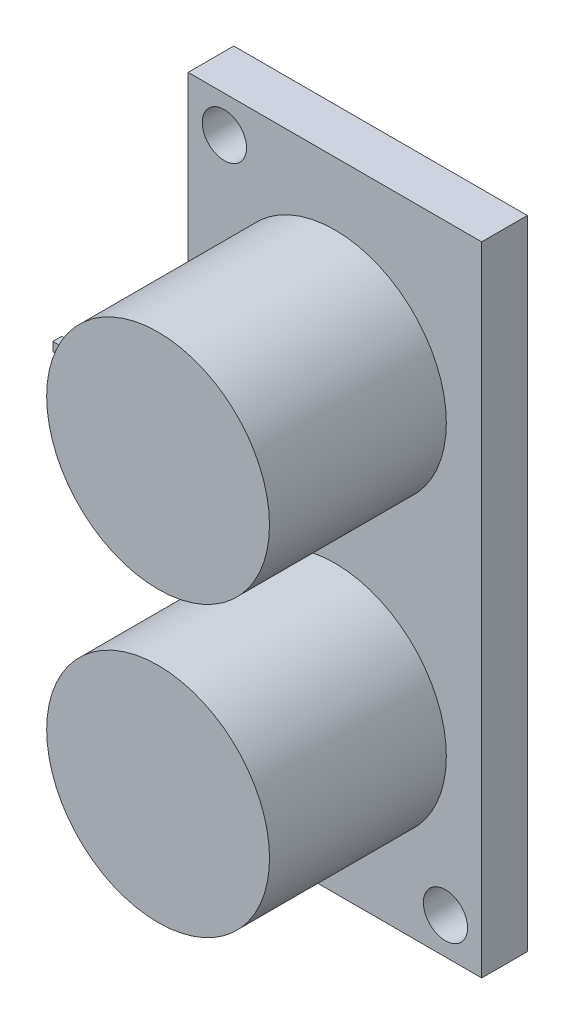
ISO-10303-21;
HEADER;
FILE_DESCRIPTION(('STEP AP214'),'2;1');
FILE_NAME('part.step','',(''),(''),'','','');
FILE_SCHEMA(('AUTOMOTIVE_DESIGN { 1 0 10303 214 1 1 1 1 }'));
ENDSEC;
DATA;
#1=APPLICATION_CONTEXT('core data for automotive mechanical design processes');
#2=APPLICATION_PROTOCOL_DEFINITION('international standard','automotive_design',2000,#1);
#3=PRODUCT_CONTEXT('',#1,'mechanical');
#4=PRODUCT('Part','Part','',(#3));
#5=PRODUCT_RELATED_PRODUCT_CATEGORY('part','',(#4));
#6=PRODUCT_DEFINITION_FORMATION('','',#4);
#7=PRODUCT_DEFINITION_CONTEXT('part definition',#1,'design');
#8=PRODUCT_DEFINITION('design','',#6,#7);
#9=PRODUCT_DEFINITION_SHAPE('','',#8);
#10=(LENGTH_UNIT() NAMED_UNIT(*) SI_UNIT(.MILLI.,.METRE.));
#11=(NAMED_UNIT(*) PLANE_ANGLE_UNIT() SI_UNIT($,.RADIAN.));
#12=(NAMED_UNIT(*) SI_UNIT($,.STERADIAN.) SOLID_ANGLE_UNIT());
#13=UNCERTAINTY_MEASURE_WITH_UNIT(LENGTH_MEASURE(1.E-05),#10,'distance_accuracy_value','');
#14=(GEOMETRIC_REPRESENTATION_CONTEXT(3) GLOBAL_UNCERTAINTY_ASSIGNED_CONTEXT((#13)) GLOBAL_UNIT_ASSIGNED_CONTEXT((#10,
#11,#12)) REPRESENTATION_CONTEXT('',''));
#15=CARTESIAN_POINT('',(0.,0.,0.));
#16=DIRECTION('',(0.,0.,1.));
#17=DIRECTION('',(1.,0.,0.));
#18=AXIS2_PLACEMENT_3D('',#15,#16,#17);
#19=CARTESIAN_POINT('',(-12.319,3.84174999999999,5.8166));
#20=DIRECTION('',(1.,0.,0.));
#21=DIRECTION('',(0.,1.,0.));
#22=AXIS2_PLACEMENT_3D('',#19,#20,#21);
#23=PLANE('',#22);
#24=DIRECTION('',(0.,0.,1.));
#25=VECTOR('',#24,1.);
#26=CARTESIAN_POINT('',(-12.319,2.25424999999999,4.8641));
#27=LINE('',#26,#25);
#28=CARTESIAN_POINT('',(-12.319,2.25424999999999,4.2291));
#29=VERTEX_POINT('',#28);
#30=CARTESIAN_POINT('',(-12.319,2.25424999999999,4.8641));
#31=VERTEX_POINT('',#30);
#32=EDGE_CURVE('E185',#29,#31,#27,.T.);
#33=ORIENTED_EDGE('',*,*,#32,.F.);
#34=DIRECTION('',(0.,-1.,0.));
#35=VECTOR('',#34,1.);
#36=CARTESIAN_POINT('',(-12.319,2.88924999999999,4.2291));
#37=LINE('',#36,#35);
#38=CARTESIAN_POINT('',(-12.319,2.88924999999999,4.2291));
#39=VERTEX_POINT('',#38);
#40=EDGE_CURVE('E188',#39,#29,#37,.T.);
#41=ORIENTED_EDGE('',*,*,#40,.F.);
#42=DIRECTION('',(0.,0.,-1.));
#43=VECTOR('',#42,1.);
#44=CARTESIAN_POINT('',(-12.319,2.88924999999999,4.8641));
#45=LINE('',#44,#43);
#46=CARTESIAN_POINT('',(-12.319,2.88924999999999,4.8641));
#47=VERTEX_POINT('',#46);
#48=EDGE_CURVE('E207',#47,#39,#45,.T.);
#49=ORIENTED_EDGE('',*,*,#48,.F.);
#50=DIRECTION('',(0.,1.,0.));
#51=VECTOR('',#50,1.);
#52=CARTESIAN_POINT('',(-12.319,2.88924999999999,4.8641));
#53=LINE('',#52,#51);
#54=EDGE_CURVE('E191',#31,#47,#53,.T.);
#55=ORIENTED_EDGE('',*,*,#54,.F.);
#56=EDGE_LOOP('',(#33,#41,#49,#55));
#57=FACE_BOUND('',#56,.T.);
#58=DIRECTION('',(0.,-1.,0.));
#59=VECTOR('',#58,1.);
#60=CARTESIAN_POINT('',(-12.319,3.84174999999999,3.2766));
#61=LINE('',#60,#59);
#62=CARTESIAN_POINT('',(-12.319,3.84174999999999,3.2766));
#63=VERTEX_POINT('',#62);
#64=CARTESIAN_POINT('',(-12.319,-3.77825000000001,3.2766));
#65=VERTEX_POINT('',#64);
#66=EDGE_CURVE('E305',#63,#65,#61,.T.);
#67=ORIENTED_EDGE('',*,*,#66,.T.);
#68=DIRECTION('',(0.,0.,-1.));
#69=VECTOR('',#68,1.);
#70=CARTESIAN_POINT('',(-12.319,-3.77825000000001,5.8166));
#71=LINE('',#70,#69);
#72=CARTESIAN_POINT('',(-12.319,-3.77825000000001,5.8166));
#73=VERTEX_POINT('',#72);
#74=EDGE_CURVE('E312',#73,#65,#71,.T.);
#75=ORIENTED_EDGE('',*,*,#74,.F.);
#76=DIRECTION('',(0.,-1.,0.));
#77=VECTOR('',#76,1.);
#78=CARTESIAN_POINT('',(-12.319,3.84174999999999,5.8166));
#79=LINE('',#78,#77);
#80=CARTESIAN_POINT('',(-12.319,3.84174999999999,5.8166));
#81=VERTEX_POINT('',#80);
#82=EDGE_CURVE('E294',#81,#73,#79,.T.);
#83=ORIENTED_EDGE('',*,*,#82,.F.);
#84=DIRECTION('',(0.,0.,-1.));
#85=VECTOR('',#84,1.);
#86=CARTESIAN_POINT('',(-12.319,3.84174999999999,5.8166));
#87=LINE('',#86,#85);
#88=EDGE_CURVE('E315',#81,#63,#87,.T.);
#89=ORIENTED_EDGE('',*,*,#88,.T.);
#90=EDGE_LOOP('',(#67,#75,#83,#89));
#91=FACE_BOUND('',#90,.T.);
#92=DIRECTION('',(0.,0.,1.));
#93=VECTOR('',#92,1.);
#94=CARTESIAN_POINT('',(-12.319,-0.285750000000009,4.8641));
#95=LINE('',#94,#93);
#96=CARTESIAN_POINT('',(-12.319,-0.285750000000009,4.2291));
#97=VERTEX_POINT('',#96);
#98=CARTESIAN_POINT('',(-12.319,-0.28575000000001,4.8641));
#99=VERTEX_POINT('',#98);
#100=EDGE_CURVE('E196',#97,#99,#95,.T.);
#101=ORIENTED_EDGE('',*,*,#100,.F.);
#102=DIRECTION('',(0.,-1.,0.));
#103=VECTOR('',#102,1.);
#104=CARTESIAN_POINT('',(-12.319,0.349249999999991,4.2291));
#105=LINE('',#104,#103);
#106=CARTESIAN_POINT('',(-12.319,0.349249999999991,4.2291));
#107=VERTEX_POINT('',#106);
#108=EDGE_CURVE('E259',#107,#97,#105,.T.);
#109=ORIENTED_EDGE('',*,*,#108,.F.);
#110=DIRECTION('',(0.,0.,-1.));
#111=VECTOR('',#110,1.);
#112=CARTESIAN_POINT('',(-12.319,0.349249999999992,4.8641));
#113=LINE('',#112,#111);
#114=CARTESIAN_POINT('',(-12.319,0.349249999999991,4.8641));
#115=VERTEX_POINT('',#114);
#116=EDGE_CURVE('E271',#115,#107,#113,.T.);
#117=ORIENTED_EDGE('',*,*,#116,.F.);
#118=DIRECTION('',(0.,1.,0.));
#119=VECTOR('',#118,1.);
#120=CARTESIAN_POINT('',(-12.319,0.349249999999992,4.8641));
#121=LINE('',#120,#119);
#122=EDGE_CURVE('E268',#99,#115,#121,.T.);
#123=ORIENTED_EDGE('',*,*,#122,.F.);
#124=EDGE_LOOP('',(#101,#109,#117,#123));
#125=FACE_BOUND('',#124,.T.);
#126=DIRECTION('',(0.,1.,0.));
#127=VECTOR('',#126,1.);
#128=CARTESIAN_POINT('',(-12.319,-2.82575000000001,4.8641));
#129=LINE('',#128,#127);
#130=CARTESIAN_POINT('',(-12.319,-2.82575000000001,4.8641));
#131=VERTEX_POINT('',#130);
#132=CARTESIAN_POINT('',(-12.319,-2.19075000000001,4.8641));
#133=VERTEX_POINT('',#132);
#134=EDGE_CURVE('E244',#131,#133,#129,.T.);
#135=ORIENTED_EDGE('',*,*,#134,.F.);
#136=DIRECTION('',(0.,0.,1.));
#137=VECTOR('',#136,1.);
#138=CARTESIAN_POINT('',(-12.319,-2.82575000000001,4.8641));
#139=LINE('',#138,#137);
#140=CARTESIAN_POINT('',(-12.319,-2.82575000000001,4.2291));
#141=VERTEX_POINT('',#140);
#142=EDGE_CURVE('E238',#141,#131,#139,.T.);
#143=ORIENTED_EDGE('',*,*,#142,.F.);
#144=DIRECTION('',(0.,-1.,0.));
#145=VECTOR('',#144,1.);
#146=CARTESIAN_POINT('',(-12.319,-2.82575000000001,4.2291));
#147=LINE('',#146,#145);
#148=CARTESIAN_POINT('',(-12.319,-2.19075000000001,4.2291));
#149=VERTEX_POINT('',#148);
#150=EDGE_CURVE('E65',#149,#141,#147,.T.);
#151=ORIENTED_EDGE('',*,*,#150,.F.);
#152=DIRECTION('',(0.,0.,-1.));
#153=VECTOR('',#152,1.);
#154=CARTESIAN_POINT('',(-12.319,-2.19075000000001,4.8641));
#155=LINE('',#154,#153);
#156=EDGE_CURVE('E60',#133,#149,#155,.T.);
#157=ORIENTED_EDGE('',*,*,#156,.F.);
#158=EDGE_LOOP('',(#135,#143,#151,#157));
#159=FACE_BOUND('',#158,.T.);
#160=ADVANCED_FACE('F45',(#57,#91,#125,#159),#23,.F.);
#161=CARTESIAN_POINT('',(0.,0.,3.2766));
#162=DIRECTION('',(0.,0.,1.));
#163=DIRECTION('',(1.,0.,0.));
#164=AXIS2_PLACEMENT_3D('',#161,#162,#163);
#165=PLANE('',#164);
#166=CARTESIAN_POINT('',(0.,10.362469871031,3.2766));
#167=DIRECTION('',(0.,0.,1.));
#168=DIRECTION('',(1.,0.,0.));
#169=AXIS2_PLACEMENT_3D('',#166,#167,#168);
#170=CIRCLE('',#169,8.001);
#171=CARTESIAN_POINT('',(8.00099999999999,10.362469871031,3.2766));
#172=VERTEX_POINT('',#171);
#173=EDGE_CURVE('E326',#172,#172,#170,.T.);
#174=ORIENTED_EDGE('',*,*,#173,.F.);
#175=EDGE_LOOP('',(#174));
#176=FACE_BOUND('',#175,.T.);
#177=CARTESIAN_POINT('',(0.,-10.362469871031,3.2766));
#178=DIRECTION('',(0.,0.,1.));
#179=DIRECTION('',(1.,0.,0.));
#180=AXIS2_PLACEMENT_3D('',#177,#178,#179);
#181=CIRCLE('',#180,8.001);
#182=CARTESIAN_POINT('',(8.001,-10.362469871031,3.2766));
#183=VERTEX_POINT('',#182);
#184=EDGE_CURVE('E329',#183,#183,#181,.T.);
#185=ORIENTED_EDGE('',*,*,#184,.F.);
#186=EDGE_LOOP('',(#185));
#187=FACE_BOUND('',#186,.T.);
#188=CARTESIAN_POINT('',(7.9375,-20.28825,3.2766));
#189=DIRECTION('',(0.,0.,1.));
#190=DIRECTION('',(1.,0.,0.));
#191=AXIS2_PLACEMENT_3D('',#188,#189,#190);
#192=CIRCLE('',#191,1.5875);
#193=CARTESIAN_POINT('',(6.35,-20.28825,3.2766));
#194=VERTEX_POINT('',#193);
#195=EDGE_CURVE('E340',#194,#194,#192,.T.);
#196=ORIENTED_EDGE('',*,*,#195,.F.);
#197=EDGE_LOOP('',(#196));
#198=FACE_BOUND('',#197,.T.);
#199=CARTESIAN_POINT('',(-7.9375,20.28825,3.2766));
#200=DIRECTION('',(0.,0.,1.));
#201=DIRECTION('',(1.,0.,0.));
#202=AXIS2_PLACEMENT_3D('',#199,#200,#201);
#203=CIRCLE('',#202,1.5875);
#204=CARTESIAN_POINT('',(-9.525,20.28825,3.2766));
#205=VERTEX_POINT('',#204);
#206=EDGE_CURVE('E334',#205,#205,#203,.T.);
#207=ORIENTED_EDGE('',*,*,#206,.F.);
#208=EDGE_LOOP('',(#207));
#209=FACE_BOUND('',#208,.T.);
#210=DIRECTION('',(0.,-1.,0.));
#211=VECTOR('',#210,1.);
#212=CARTESIAN_POINT('',(-10.541,-22.89175,3.2766));
#213=LINE('',#212,#211);
#214=CARTESIAN_POINT('',(-10.541,22.89175,3.2766));
#215=VERTEX_POINT('',#214);
#216=CARTESIAN_POINT('',(-10.541,3.84174999999999,3.2766));
#217=VERTEX_POINT('',#216);
#218=EDGE_CURVE('E351',#215,#217,#213,.T.);
#219=ORIENTED_EDGE('',*,*,#218,.T.);
#220=DIRECTION('',(-1.,0.,0.));
#221=VECTOR('',#220,1.);
#222=CARTESIAN_POINT('',(-12.319,3.84174999999999,3.2766));
#223=LINE('',#222,#221);
#224=CARTESIAN_POINT('',(-9.779,3.84174999999999,3.2766));
#225=VERTEX_POINT('',#224);
#226=EDGE_CURVE('E302',#225,#217,#223,.T.);
#227=ORIENTED_EDGE('',*,*,#226,.F.);
#228=DIRECTION('',(0.,1.,0.));
#229=VECTOR('',#228,1.);
#230=CARTESIAN_POINT('',(-9.779,3.84174999999999,3.2766));
#231=LINE('',#230,#229);
#232=CARTESIAN_POINT('',(-9.779,-3.77825000000001,3.2766));
#233=VERTEX_POINT('',#232);
#234=EDGE_CURVE('E287',#233,#225,#231,.T.);
#235=ORIENTED_EDGE('',*,*,#234,.F.);
#236=DIRECTION('',(1.,0.,0.));
#237=VECTOR('',#236,1.);
#238=CARTESIAN_POINT('',(-12.319,-3.77825000000001,3.2766));
#239=LINE('',#238,#237);
#240=CARTESIAN_POINT('',(-10.541,-3.77825000000001,3.2766));
#241=VERTEX_POINT('',#240);
#242=EDGE_CURVE('E307',#241,#233,#239,.T.);
#243=ORIENTED_EDGE('',*,*,#242,.F.);
#244=CARTESIAN_POINT('',(-10.541,-22.89175,3.2766));
#245=VERTEX_POINT('',#244);
#246=EDGE_CURVE('E349',#241,#245,#213,.T.);
#247=ORIENTED_EDGE('',*,*,#246,.T.);
#248=DIRECTION('',(1.,0.,0.));
#249=VECTOR('',#248,1.);
#250=CARTESIAN_POINT('',(-10.541,-22.89175,3.2766));
#251=LINE('',#250,#249);
#252=CARTESIAN_POINT('',(10.541,-22.89175,3.2766));
#253=VERTEX_POINT('',#252);
#254=EDGE_CURVE('E354',#245,#253,#251,.T.);
#255=ORIENTED_EDGE('',*,*,#254,.T.);
#256=DIRECTION('',(0.,1.,0.));
#257=VECTOR('',#256,1.);
#258=CARTESIAN_POINT('',(10.541,-22.89175,3.2766));
#259=LINE('',#258,#257);
#260=CARTESIAN_POINT('',(10.541,22.89175,3.2766));
#261=VERTEX_POINT('',#260);
#262=EDGE_CURVE('E357',#253,#261,#259,.T.);
#263=ORIENTED_EDGE('',*,*,#262,.T.);
#264=DIRECTION('',(-1.,0.,0.));
#265=VECTOR('',#264,1.);
#266=CARTESIAN_POINT('',(-10.541,22.89175,3.2766));
#267=LINE('',#266,#265);
#268=EDGE_CURVE('E346',#261,#215,#267,.T.);
#269=ORIENTED_EDGE('',*,*,#268,.T.);
#270=EDGE_LOOP('',(#219,#227,#235,#243,#247,#255,#263,#269));
#271=FACE_BOUND('',#270,.T.);
#272=ADVANCED_FACE('F392',(#176,#187,#198,#209,#271),#165,.T.);
#273=CARTESIAN_POINT('',(0.,0.,0.));
#274=DIRECTION('',(0.,0.,1.));
#275=DIRECTION('',(1.,0.,0.));
#276=AXIS2_PLACEMENT_3D('',#273,#274,#275);
#277=PLANE('',#276);
#278=DIRECTION('',(-1.,0.,0.));
#279=VECTOR('',#278,1.);
#280=CARTESIAN_POINT('',(-10.541,22.89175,0.));
#281=LINE('',#280,#279);
#282=CARTESIAN_POINT('',(10.541,22.89175,0.));
#283=VERTEX_POINT('',#282);
#284=CARTESIAN_POINT('',(-10.541,22.89175,0.));
#285=VERTEX_POINT('',#284);
#286=EDGE_CURVE('E343',#283,#285,#281,.T.);
#287=ORIENTED_EDGE('',*,*,#286,.F.);
#288=DIRECTION('',(0.,1.,0.));
#289=VECTOR('',#288,1.);
#290=CARTESIAN_POINT('',(10.541,-22.89175,0.));
#291=LINE('',#290,#289);
#292=CARTESIAN_POINT('',(10.541,-22.89175,0.));
#293=VERTEX_POINT('',#292);
#294=EDGE_CURVE('E350',#293,#283,#291,.T.);
#295=ORIENTED_EDGE('',*,*,#294,.F.);
#296=DIRECTION('',(1.,0.,0.));
#297=VECTOR('',#296,1.);
#298=CARTESIAN_POINT('',(-10.541,-22.89175,0.));
#299=LINE('',#298,#297);
#300=CARTESIAN_POINT('',(-10.541,-22.89175,0.));
#301=VERTEX_POINT('',#300);
#302=EDGE_CURVE('E364',#301,#293,#299,.T.);
#303=ORIENTED_EDGE('',*,*,#302,.F.);
#304=DIRECTION('',(0.,-1.,0.));
#305=VECTOR('',#304,1.);
#306=CARTESIAN_POINT('',(-10.541,-22.89175,0.));
#307=LINE('',#306,#305);
#308=EDGE_CURVE('E362',#285,#301,#307,.T.);
#309=ORIENTED_EDGE('',*,*,#308,.F.);
#310=EDGE_LOOP('',(#287,#295,#303,#309));
#311=FACE_BOUND('',#310,.T.);
#312=CARTESIAN_POINT('',(7.9375,-20.28825,0.));
#313=DIRECTION('',(0.,0.,1.));
#314=DIRECTION('',(1.,0.,0.));
#315=AXIS2_PLACEMENT_3D('',#312,#313,#314);
#316=CIRCLE('',#315,1.5875);
#317=CARTESIAN_POINT('',(6.35,-20.28825,0.));
#318=VERTEX_POINT('',#317);
#319=EDGE_CURVE('E337',#318,#318,#316,.T.);
#320=ORIENTED_EDGE('',*,*,#319,.T.);
#321=EDGE_LOOP('',(#320));
#322=FACE_BOUND('',#321,.T.);
#323=CARTESIAN_POINT('',(-7.9375,20.28825,0.));
#324=DIRECTION('',(0.,0.,1.));
#325=DIRECTION('',(1.,0.,0.));
#326=AXIS2_PLACEMENT_3D('',#323,#324,#325);
#327=CIRCLE('',#326,1.5875);
#328=CARTESIAN_POINT('',(-9.525,20.28825,0.));
#329=VERTEX_POINT('',#328);
#330=EDGE_CURVE('E325',#329,#329,#327,.T.);
#331=ORIENTED_EDGE('',*,*,#330,.T.);
#332=EDGE_LOOP('',(#331));
#333=FACE_BOUND('',#332,.T.);
#334=ADVANCED_FACE('F382',(#311,#322,#333),#277,.F.);
#335=CARTESIAN_POINT('',(-10.541,22.89175,3.2766));
#336=DIRECTION('',(0.,-1.,0.));
#337=DIRECTION('',(1.,0.,0.));
#338=AXIS2_PLACEMENT_3D('',#335,#336,#337);
#339=PLANE('',#338);
#340=ORIENTED_EDGE('',*,*,#286,.T.);
#341=DIRECTION('',(0.,0.,-1.));
#342=VECTOR('',#341,1.);
#343=CARTESIAN_POINT('',(-10.541,22.89175,3.2766));
#344=LINE('',#343,#342);
#345=EDGE_CURVE('E11',#215,#285,#344,.T.);
#346=ORIENTED_EDGE('',*,*,#345,.F.);
#347=ORIENTED_EDGE('',*,*,#268,.F.);
#348=DIRECTION('',(0.,0.,-1.));
#349=VECTOR('',#348,1.);
#350=CARTESIAN_POINT('',(10.541,22.89175,3.2766));
#351=LINE('',#350,#349);
#352=EDGE_CURVE('E359',#261,#283,#351,.T.);
#353=ORIENTED_EDGE('',*,*,#352,.T.);
#354=EDGE_LOOP('',(#340,#346,#347,#353));
#355=FACE_BOUND('',#354,.T.);
#356=ADVANCED_FACE('F47',(#355),#339,.F.);
#357=CARTESIAN_POINT('',(-10.541,-22.89175,3.2766));
#358=DIRECTION('',(1.,0.,0.));
#359=DIRECTION('',(0.,0.,-1.));
#360=AXIS2_PLACEMENT_3D('',#357,#358,#359);
#361=PLANE('',#360);
#362=ORIENTED_EDGE('',*,*,#308,.T.);
#363=DIRECTION('',(0.,0.,-1.));
#364=VECTOR('',#363,1.);
#365=CARTESIAN_POINT('',(-10.541,-22.89175,3.2766));
#366=LINE('',#365,#364);
#367=EDGE_CURVE('E53',#245,#301,#366,.T.);
#368=ORIENTED_EDGE('',*,*,#367,.F.);
#369=ORIENTED_EDGE('',*,*,#246,.F.);
#370=EDGE_CURVE('E355',#217,#241,#213,.T.);
#371=ORIENTED_EDGE('',*,*,#370,.F.);
#372=ORIENTED_EDGE('',*,*,#218,.F.);
#373=ORIENTED_EDGE('',*,*,#345,.T.);
#374=EDGE_LOOP('',(#362,#368,#369,#371,#372,#373));
#375=FACE_BOUND('',#374,.T.);
#376=ADVANCED_FACE('F470',(#375),#361,.F.);
#377=CARTESIAN_POINT('',(-10.541,-22.89175,3.2766));
#378=DIRECTION('',(0.,1.,0.));
#379=DIRECTION('',(-1.,0.,0.));
#380=AXIS2_PLACEMENT_3D('',#377,#378,#379);
#381=PLANE('',#380);
#382=ORIENTED_EDGE('',*,*,#302,.T.);
#383=DIRECTION('',(0.,0.,-1.));
#384=VECTOR('',#383,1.);
#385=CARTESIAN_POINT('',(10.541,-22.89175,3.2766));
#386=LINE('',#385,#384);
#387=EDGE_CURVE('E369',#253,#293,#386,.T.);
#388=ORIENTED_EDGE('',*,*,#387,.F.);
#389=ORIENTED_EDGE('',*,*,#254,.F.);
#390=ORIENTED_EDGE('',*,*,#367,.T.);
#391=EDGE_LOOP('',(#382,#388,#389,#390));
#392=FACE_BOUND('',#391,.T.);
#393=ADVANCED_FACE('F376',(#392),#381,.F.);
#394=CARTESIAN_POINT('',(10.541,-22.89175,3.2766));
#395=DIRECTION('',(-1.,0.,0.));
#396=DIRECTION('',(0.,0.,1.));
#397=AXIS2_PLACEMENT_3D('',#394,#395,#396);
#398=PLANE('',#397);
#399=ORIENTED_EDGE('',*,*,#294,.T.);
#400=ORIENTED_EDGE('',*,*,#352,.F.);
#401=ORIENTED_EDGE('',*,*,#262,.F.);
#402=ORIENTED_EDGE('',*,*,#387,.T.);
#403=EDGE_LOOP('',(#399,#400,#401,#402));
#404=FACE_BOUND('',#403,.T.);
#405=ADVANCED_FACE('F386',(#404),#398,.F.);
#406=CARTESIAN_POINT('',(7.9375,-20.28825,3.2766));
#407=DIRECTION('',(0.,0.,-1.));
#408=DIRECTION('',(-1.,0.,0.));
#409=AXIS2_PLACEMENT_3D('',#406,#407,#408);
#410=CYLINDRICAL_SURFACE('',#409,1.5875);
#411=CARTESIAN_POINT('',(6.35,-20.28825,3.2766));
#412=CARTESIAN_POINT('',(6.35,-20.28825,3.24246875));
#413=CARTESIAN_POINT('',(6.35,-20.28825,3.2083375));
#414=CARTESIAN_POINT('',(6.35,-20.28825,3.140075));
#415=CARTESIAN_POINT('',(6.35,-20.28825,3.10594375));
#416=CARTESIAN_POINT('',(6.35,-20.28825,3.03768125));
#417=CARTESIAN_POINT('',(6.35,-20.28825,3.00355));
#418=CARTESIAN_POINT('',(6.35,-20.28825,2.9352875));
#419=CARTESIAN_POINT('',(6.35,-20.28825,2.90115625));
#420=CARTESIAN_POINT('',(6.35,-20.28825,2.83289375));
#421=CARTESIAN_POINT('',(6.35,-20.28825,2.7987625));
#422=CARTESIAN_POINT('',(6.35,-20.28825,2.7305));
#423=CARTESIAN_POINT('',(6.35,-20.28825,2.69636875));
#424=CARTESIAN_POINT('',(6.35,-20.28825,2.62810625));
#425=CARTESIAN_POINT('',(6.35,-20.28825,2.593975));
#426=CARTESIAN_POINT('',(6.35,-20.28825,2.5257125));
#427=CARTESIAN_POINT('',(6.35,-20.28825,2.49158125));
#428=CARTESIAN_POINT('',(6.35,-20.28825,2.42331875));
#429=CARTESIAN_POINT('',(6.35,-20.28825,2.3891875));
#430=CARTESIAN_POINT('',(6.35,-20.28825,2.320925));
#431=CARTESIAN_POINT('',(6.35,-20.28825,2.28679375));
#432=CARTESIAN_POINT('',(6.35,-20.28825,2.21853125));
#433=CARTESIAN_POINT('',(6.35,-20.28825,2.1844));
#434=CARTESIAN_POINT('',(6.35,-20.28825,2.1161375));
#435=CARTESIAN_POINT('',(6.35,-20.28825,2.08200625));
#436=CARTESIAN_POINT('',(6.35,-20.28825,2.01374375));
#437=CARTESIAN_POINT('',(6.35,-20.28825,1.9796125));
#438=CARTESIAN_POINT('',(6.35,-20.28825,1.91135));
#439=CARTESIAN_POINT('',(6.35,-20.28825,1.87721875));
#440=CARTESIAN_POINT('',(6.35,-20.28825,1.80895625));
#441=CARTESIAN_POINT('',(6.35,-20.28825,1.774825));
#442=CARTESIAN_POINT('',(6.35,-20.28825,1.7065625));
#443=CARTESIAN_POINT('',(6.35,-20.28825,1.67243125));
#444=CARTESIAN_POINT('',(6.35,-20.28825,1.60416875));
#445=CARTESIAN_POINT('',(6.35,-20.28825,1.5700375));
#446=CARTESIAN_POINT('',(6.35,-20.28825,1.501775));
#447=CARTESIAN_POINT('',(6.35,-20.28825,1.46764375));
#448=CARTESIAN_POINT('',(6.35,-20.28825,1.39938125));
#449=CARTESIAN_POINT('',(6.35,-20.28825,1.36525));
#450=CARTESIAN_POINT('',(6.35,-20.28825,1.2969875));
#451=CARTESIAN_POINT('',(6.35,-20.28825,1.26285625));
#452=CARTESIAN_POINT('',(6.35,-20.28825,1.19459375));
#453=CARTESIAN_POINT('',(6.35,-20.28825,1.1604625));
#454=CARTESIAN_POINT('',(6.35,-20.28825,1.0922));
#455=CARTESIAN_POINT('',(6.35,-20.28825,1.05806875));
#456=CARTESIAN_POINT('',(6.35,-20.28825,0.98980625));
#457=CARTESIAN_POINT('',(6.35,-20.28825,0.955675));
#458=CARTESIAN_POINT('',(6.35,-20.28825,0.8874125));
#459=CARTESIAN_POINT('',(6.35,-20.28825,0.85328125));
#460=CARTESIAN_POINT('',(6.35,-20.28825,0.78501875));
#461=CARTESIAN_POINT('',(6.35,-20.28825,0.7508875));
#462=CARTESIAN_POINT('',(6.35,-20.28825,0.682625));
#463=CARTESIAN_POINT('',(6.35,-20.28825,0.64849375));
#464=CARTESIAN_POINT('',(6.35,-20.28825,0.58023125));
#465=CARTESIAN_POINT('',(6.35,-20.28825,0.5461));
#466=CARTESIAN_POINT('',(6.35,-20.28825,0.4778375));
#467=CARTESIAN_POINT('',(6.35,-20.28825,0.44370625));
#468=CARTESIAN_POINT('',(6.35,-20.28825,0.37544375));
#469=CARTESIAN_POINT('',(6.35,-20.28825,0.3413125));
#470=CARTESIAN_POINT('',(6.35,-20.28825,0.27305));
#471=CARTESIAN_POINT('',(6.35,-20.28825,0.238918749999999));
#472=CARTESIAN_POINT('',(6.35,-20.28825,0.17065625));
#473=CARTESIAN_POINT('',(6.35,-20.28825,0.136525));
#474=CARTESIAN_POINT('',(6.35,-20.28825,0.0682624999999996));
#475=CARTESIAN_POINT('',(6.35,-20.28825,0.0341312499999995));
#476=CARTESIAN_POINT('',(6.35,-20.28825,0.));
#477=B_SPLINE_CURVE_WITH_KNOTS('',3,(#411,#412,#413,#414,#415,#416,#417,#418,#419,#420,#421,
#422,#423,#424,#425,#426,#427,#428,#429,#430,#431,#432,#433,#434,#435,#436,#437,#438,#439,#440,
#441,#442,#443,#444,#445,#446,#447,#448,#449,#450,#451,#452,#453,#454,#455,#456,#457,#458,#459,
#460,#461,#462,#463,#464,#465,#466,#467,#468,#469,#470,#471,#472,#473,#474,#475,#476),
.UNSPECIFIED.,.F.,.F.,(4,2,2,2,2,2,2,2,2,2,2,2,2,2,2,2,2,2,2,2,2,2,2,2,2,2,2,2,2,2,2,2,4),(0.,
0.10239375,0.2047875,0.30718125,0.409575,0.51196875,0.6143625,0.71675625,0.81915,0.92154375,
1.0239375,1.12633125,1.228725,1.33111875,1.4335125,1.53590625,1.6383,1.74069375,1.8430875,
1.94548125,2.047875,2.15026875,2.2526625,2.35505625,2.45745,2.55984375,2.6622375,2.76463125,
2.867025,2.96941875,3.0718125,3.17420625,3.2766),.UNSPECIFIED.);
#478=EDGE_CURVE('BSEAM460',#194,#318,#477,.T.);
#479=ORIENTED_EDGE('',*,*,#195,.T.);
#480=ORIENTED_EDGE('',*,*,#319,.F.);
#481=ORIENTED_EDGE('',*,*,#478,.T.);
#482=ORIENTED_EDGE('',*,*,#478,.F.);
#483=EDGE_LOOP('',(#479,#481,#480,#482));
#484=FACE_BOUND('',#483,.T.);
#485=ADVANCED_FACE('F460',(#484),#410,.F.);
#486=CARTESIAN_POINT('',(-7.9375,20.28825,3.2766));
#487=DIRECTION('',(0.,0.,-1.));
#488=DIRECTION('',(-1.,0.,0.));
#489=AXIS2_PLACEMENT_3D('',#486,#487,#488);
#490=CYLINDRICAL_SURFACE('',#489,1.5875);
#491=CARTESIAN_POINT('',(-9.525,20.28825,3.2766));
#492=CARTESIAN_POINT('',(-9.525,20.28825,3.24246875));
#493=CARTESIAN_POINT('',(-9.525,20.28825,3.2083375));
#494=CARTESIAN_POINT('',(-9.525,20.28825,3.140075));
#495=CARTESIAN_POINT('',(-9.525,20.28825,3.10594375));
#496=CARTESIAN_POINT('',(-9.525,20.28825,3.03768125));
#497=CARTESIAN_POINT('',(-9.525,20.28825,3.00355));
#498=CARTESIAN_POINT('',(-9.525,20.28825,2.9352875));
#499=CARTESIAN_POINT('',(-9.525,20.28825,2.90115625));
#500=CARTESIAN_POINT('',(-9.525,20.28825,2.83289375));
#501=CARTESIAN_POINT('',(-9.525,20.28825,2.7987625));
#502=CARTESIAN_POINT('',(-9.525,20.28825,2.7305));
#503=CARTESIAN_POINT('',(-9.525,20.28825,2.69636875));
#504=CARTESIAN_POINT('',(-9.525,20.28825,2.62810625));
#505=CARTESIAN_POINT('',(-9.525,20.28825,2.593975));
#506=CARTESIAN_POINT('',(-9.525,20.28825,2.5257125));
#507=CARTESIAN_POINT('',(-9.525,20.28825,2.49158125));
#508=CARTESIAN_POINT('',(-9.525,20.28825,2.42331875));
#509=CARTESIAN_POINT('',(-9.525,20.28825,2.3891875));
#510=CARTESIAN_POINT('',(-9.525,20.28825,2.320925));
#511=CARTESIAN_POINT('',(-9.525,20.28825,2.28679375));
#512=CARTESIAN_POINT('',(-9.525,20.28825,2.21853125));
#513=CARTESIAN_POINT('',(-9.525,20.28825,2.1844));
#514=CARTESIAN_POINT('',(-9.525,20.28825,2.1161375));
#515=CARTESIAN_POINT('',(-9.525,20.28825,2.08200625));
#516=CARTESIAN_POINT('',(-9.525,20.28825,2.01374375));
#517=CARTESIAN_POINT('',(-9.525,20.28825,1.9796125));
#518=CARTESIAN_POINT('',(-9.525,20.28825,1.91135));
#519=CARTESIAN_POINT('',(-9.525,20.28825,1.87721875));
#520=CARTESIAN_POINT('',(-9.525,20.28825,1.80895625));
#521=CARTESIAN_POINT('',(-9.525,20.28825,1.774825));
#522=CARTESIAN_POINT('',(-9.525,20.28825,1.7065625));
#523=CARTESIAN_POINT('',(-9.525,20.28825,1.67243125));
#524=CARTESIAN_POINT('',(-9.525,20.28825,1.60416875));
#525=CARTESIAN_POINT('',(-9.525,20.28825,1.5700375));
#526=CARTESIAN_POINT('',(-9.525,20.28825,1.501775));
#527=CARTESIAN_POINT('',(-9.525,20.28825,1.46764375));
#528=CARTESIAN_POINT('',(-9.525,20.28825,1.39938125));
#529=CARTESIAN_POINT('',(-9.525,20.28825,1.36525));
#530=CARTESIAN_POINT('',(-9.525,20.28825,1.2969875));
#531=CARTESIAN_POINT('',(-9.525,20.28825,1.26285625));
#532=CARTESIAN_POINT('',(-9.525,20.28825,1.19459375));
#533=CARTESIAN_POINT('',(-9.525,20.28825,1.1604625));
#534=CARTESIAN_POINT('',(-9.525,20.28825,1.0922));
#535=CARTESIAN_POINT('',(-9.525,20.28825,1.05806875));
#536=CARTESIAN_POINT('',(-9.525,20.28825,0.98980625));
#537=CARTESIAN_POINT('',(-9.525,20.28825,0.955675));
#538=CARTESIAN_POINT('',(-9.525,20.28825,0.8874125));
#539=CARTESIAN_POINT('',(-9.525,20.28825,0.85328125));
#540=CARTESIAN_POINT('',(-9.525,20.28825,0.78501875));
#541=CARTESIAN_POINT('',(-9.525,20.28825,0.7508875));
#542=CARTESIAN_POINT('',(-9.525,20.28825,0.682625));
#543=CARTESIAN_POINT('',(-9.525,20.28825,0.64849375));
#544=CARTESIAN_POINT('',(-9.525,20.28825,0.58023125));
#545=CARTESIAN_POINT('',(-9.525,20.28825,0.5461));
#546=CARTESIAN_POINT('',(-9.525,20.28825,0.4778375));
#547=CARTESIAN_POINT('',(-9.525,20.28825,0.44370625));
#548=CARTESIAN_POINT('',(-9.525,20.28825,0.37544375));
#549=CARTESIAN_POINT('',(-9.525,20.28825,0.3413125));
#550=CARTESIAN_POINT('',(-9.525,20.28825,0.27305));
#551=CARTESIAN_POINT('',(-9.525,20.28825,0.238918749999999));
#552=CARTESIAN_POINT('',(-9.525,20.28825,0.17065625));
#553=CARTESIAN_POINT('',(-9.525,20.28825,0.136525));
#554=CARTESIAN_POINT('',(-9.525,20.28825,0.0682624999999996));
#555=CARTESIAN_POINT('',(-9.525,20.28825,0.0341312499999995));
#556=CARTESIAN_POINT('',(-9.525,20.28825,0.));
#557=B_SPLINE_CURVE_WITH_KNOTS('',3,(#491,#492,#493,#494,#495,#496,#497,#498,#499,#500,#501,
#502,#503,#504,#505,#506,#507,#508,#509,#510,#511,#512,#513,#514,#515,#516,#517,#518,#519,#520,
#521,#522,#523,#524,#525,#526,#527,#528,#529,#530,#531,#532,#533,#534,#535,#536,#537,#538,#539,
#540,#541,#542,#543,#544,#545,#546,#547,#548,#549,#550,#551,#552,#553,#554,#555,#556),
.UNSPECIFIED.,.F.,.F.,(4,2,2,2,2,2,2,2,2,2,2,2,2,2,2,2,2,2,2,2,2,2,2,2,2,2,2,2,2,2,2,2,4),(0.,
0.10239375,0.2047875,0.30718125,0.409575,0.51196875,0.6143625,0.71675625,0.81915,0.92154375,
1.0239375,1.12633125,1.228725,1.33111875,1.4335125,1.53590625,1.6383,1.74069375,1.8430875,
1.94548125,2.047875,2.15026875,2.2526625,2.35505625,2.45745,2.55984375,2.6622375,2.76463125,
2.867025,2.96941875,3.0718125,3.17420625,3.2766),.UNSPECIFIED.);
#558=EDGE_CURVE('BSEAM453',#205,#329,#557,.T.);
#559=ORIENTED_EDGE('',*,*,#206,.T.);
#560=ORIENTED_EDGE('',*,*,#330,.F.);
#561=ORIENTED_EDGE('',*,*,#558,.T.);
#562=ORIENTED_EDGE('',*,*,#558,.F.);
#563=EDGE_LOOP('',(#559,#561,#560,#562));
#564=FACE_BOUND('',#563,.T.);
#565=ADVANCED_FACE('F453',(#564),#490,.F.);
#566=CARTESIAN_POINT('',(0.,-10.362469871031,15.9766));
#567=DIRECTION('',(0.,0.,-1.));
#568=DIRECTION('',(-1.,0.,0.));
#569=AXIS2_PLACEMENT_3D('',#566,#567,#568);
#570=CYLINDRICAL_SURFACE('',#569,8.001);
#571=CARTESIAN_POINT('',(0.,-10.362469871031,15.9766));
#572=DIRECTION('',(0.,0.,1.));
#573=DIRECTION('',(1.,0.,0.));
#574=AXIS2_PLACEMENT_3D('',#571,#572,#573);
#575=CIRCLE('',#574,8.001);
#576=CARTESIAN_POINT('',(8.001,-10.362469871031,15.9766));
#577=VERTEX_POINT('',#576);
#578=EDGE_CURVE('E321',#577,#577,#575,.T.);
#579=ORIENTED_EDGE('',*,*,#578,.F.);
#580=EDGE_LOOP('',(#579));
#581=FACE_BOUND('',#580,.T.);
#582=ORIENTED_EDGE('',*,*,#184,.T.);
#583=EDGE_LOOP('',(#582));
#584=FACE_BOUND('',#583,.T.);
#585=ADVANCED_FACE('F450',(#581,#584),#570,.T.);
#586=CARTESIAN_POINT('',(0.,-10.362469871031,15.9766));
#587=DIRECTION('',(0.,0.,1.));
#588=DIRECTION('',(1.,0.,0.));
#589=AXIS2_PLACEMENT_3D('',#586,#587,#588);
#590=PLANE('',#589);
#591=ORIENTED_EDGE('',*,*,#578,.T.);
#592=EDGE_LOOP('',(#591));
#593=FACE_BOUND('',#592,.T.);
#594=ADVANCED_FACE('F448',(#593),#590,.T.);
#595=CARTESIAN_POINT('',(0.,10.362469871031,15.9766));
#596=DIRECTION('',(0.,0.,-1.));
#597=DIRECTION('',(-1.,0.,0.));
#598=AXIS2_PLACEMENT_3D('',#595,#596,#597);
#599=CYLINDRICAL_SURFACE('',#598,8.001);
#600=CARTESIAN_POINT('',(0.,10.362469871031,15.9766));
#601=DIRECTION('',(0.,0.,1.));
#602=DIRECTION('',(1.,0.,0.));
#603=AXIS2_PLACEMENT_3D('',#600,#601,#602);
#604=CIRCLE('',#603,8.001);
#605=CARTESIAN_POINT('',(8.00099999999999,10.362469871031,15.9766));
#606=VERTEX_POINT('',#605);
#607=EDGE_CURVE('E322',#606,#606,#604,.T.);
#608=ORIENTED_EDGE('',*,*,#607,.F.);
#609=EDGE_LOOP('',(#608));
#610=FACE_BOUND('',#609,.T.);
#611=ORIENTED_EDGE('',*,*,#173,.T.);
#612=EDGE_LOOP('',(#611));
#613=FACE_BOUND('',#612,.T.);
#614=ADVANCED_FACE('F444',(#610,#613),#599,.T.);
#615=CARTESIAN_POINT('',(0.,10.362469871031,15.9766));
#616=DIRECTION('',(0.,0.,1.));
#617=DIRECTION('',(1.,0.,0.));
#618=AXIS2_PLACEMENT_3D('',#615,#616,#617);
#619=PLANE('',#618);
#620=ORIENTED_EDGE('',*,*,#607,.T.);
#621=EDGE_LOOP('',(#620));
#622=FACE_BOUND('',#621,.T.);
#623=ADVANCED_FACE('F441',(#622),#619,.T.);
#624=CARTESIAN_POINT('',(0.,0.,3.2766));
#625=DIRECTION('',(0.,0.,1.));
#626=DIRECTION('',(1.,0.,0.));
#627=AXIS2_PLACEMENT_3D('',#624,#625,#626);
#628=PLANE('',#627);
#629=EDGE_CURVE('E301',#217,#63,#223,.T.);
#630=ORIENTED_EDGE('',*,*,#629,.F.);
#631=ORIENTED_EDGE('',*,*,#370,.T.);
#632=EDGE_CURVE('E292',#65,#241,#239,.T.);
#633=ORIENTED_EDGE('',*,*,#632,.F.);
#634=ORIENTED_EDGE('',*,*,#66,.F.);
#635=EDGE_LOOP('',(#630,#631,#633,#634));
#636=FACE_BOUND('',#635,.T.);
#637=ADVANCED_FACE('F399',(#636),#628,.F.);
#638=CARTESIAN_POINT('',(-9.779,3.84174999999999,5.8166));
#639=DIRECTION('',(-1.,0.,0.));
#640=DIRECTION('',(0.,-1.,0.));
#641=AXIS2_PLACEMENT_3D('',#638,#639,#640);
#642=PLANE('',#641);
#643=ORIENTED_EDGE('',*,*,#234,.T.);
#644=DIRECTION('',(0.,0.,-1.));
#645=VECTOR('',#644,1.);
#646=CARTESIAN_POINT('',(-9.779,3.84174999999999,5.8166));
#647=LINE('',#646,#645);
#648=CARTESIAN_POINT('',(-9.779,3.84174999999999,5.8166));
#649=VERTEX_POINT('',#648);
#650=EDGE_CURVE('E318',#649,#225,#647,.T.);
#651=ORIENTED_EDGE('',*,*,#650,.F.);
#652=DIRECTION('',(0.,1.,0.));
#653=VECTOR('',#652,1.);
#654=CARTESIAN_POINT('',(-9.779,3.84174999999999,5.8166));
#655=LINE('',#654,#653);
#656=CARTESIAN_POINT('',(-9.779,-3.77825000000001,5.8166));
#657=VERTEX_POINT('',#656);
#658=EDGE_CURVE('E288',#657,#649,#655,.T.);
#659=ORIENTED_EDGE('',*,*,#658,.F.);
#660=DIRECTION('',(0.,0.,-1.));
#661=VECTOR('',#660,1.);
#662=CARTESIAN_POINT('',(-9.779,-3.77825000000001,5.8166));
#663=LINE('',#662,#661);
#664=EDGE_CURVE('E298',#657,#233,#663,.T.);
#665=ORIENTED_EDGE('',*,*,#664,.T.);
#666=EDGE_LOOP('',(#643,#651,#659,#665));
#667=FACE_BOUND('',#666,.T.);
#668=ADVANCED_FACE('F413',(#667),#642,.F.);
#669=CARTESIAN_POINT('',(-12.319,3.84174999999999,5.8166));
#670=DIRECTION('',(0.,-1.,0.));
#671=DIRECTION('',(0.,0.,-1.));
#672=AXIS2_PLACEMENT_3D('',#669,#670,#671);
#673=PLANE('',#672);
#674=ORIENTED_EDGE('',*,*,#226,.T.);
#675=ORIENTED_EDGE('',*,*,#629,.T.);
#676=ORIENTED_EDGE('',*,*,#88,.F.);
#677=DIRECTION('',(-1.,0.,0.));
#678=VECTOR('',#677,1.);
#679=CARTESIAN_POINT('',(-12.319,3.84174999999999,5.8166));
#680=LINE('',#679,#678);
#681=EDGE_CURVE('E291',#649,#81,#680,.T.);
#682=ORIENTED_EDGE('',*,*,#681,.F.);
#683=ORIENTED_EDGE('',*,*,#650,.T.);
#684=EDGE_LOOP('',(#674,#675,#676,#682,#683));
#685=FACE_BOUND('',#684,.T.);
#686=ADVANCED_FACE('F410',(#685),#673,.F.);
#687=CARTESIAN_POINT('',(-12.319,-3.77825000000001,5.8166));
#688=DIRECTION('',(0.,1.,0.));
#689=DIRECTION('',(-1.,0.,0.));
#690=AXIS2_PLACEMENT_3D('',#687,#688,#689);
#691=PLANE('',#690);
#692=ORIENTED_EDGE('',*,*,#632,.T.);
#693=ORIENTED_EDGE('',*,*,#242,.T.);
#694=ORIENTED_EDGE('',*,*,#664,.F.);
#695=DIRECTION('',(1.,0.,0.));
#696=VECTOR('',#695,1.);
#697=CARTESIAN_POINT('',(-12.319,-3.77825000000001,5.8166));
#698=LINE('',#697,#696);
#699=EDGE_CURVE('E296',#73,#657,#698,.T.);
#700=ORIENTED_EDGE('',*,*,#699,.F.);
#701=ORIENTED_EDGE('',*,*,#74,.T.);
#702=EDGE_LOOP('',(#692,#693,#694,#700,#701));
#703=FACE_BOUND('',#702,.T.);
#704=ADVANCED_FACE('F402',(#703),#691,.F.);
#705=CARTESIAN_POINT('',(0.,0.,5.8166));
#706=DIRECTION('',(0.,0.,1.));
#707=DIRECTION('',(1.,0.,0.));
#708=AXIS2_PLACEMENT_3D('',#705,#706,#707);
#709=PLANE('',#708);
#710=ORIENTED_EDGE('',*,*,#658,.T.);
#711=ORIENTED_EDGE('',*,*,#681,.T.);
#712=ORIENTED_EDGE('',*,*,#82,.T.);
#713=ORIENTED_EDGE('',*,*,#699,.T.);
#714=EDGE_LOOP('',(#710,#711,#712,#713));
#715=FACE_BOUND('',#714,.T.);
#716=ADVANCED_FACE('F416',(#715),#709,.T.);
#717=CARTESIAN_POINT('',(-18.669,-0.28575000000001,4.8641));
#718=DIRECTION('',(0.,1.,0.));
#719=DIRECTION('',(-1.,0.,0.));
#720=AXIS2_PLACEMENT_3D('',#717,#718,#719);
#721=PLANE('',#720);
#722=ORIENTED_EDGE('',*,*,#100,.T.);
#723=DIRECTION('',(1.,0.,0.));
#724=VECTOR('',#723,1.);
#725=CARTESIAN_POINT('',(-18.669,-0.28575000000001,4.8641));
#726=LINE('',#725,#724);
#727=CARTESIAN_POINT('',(-18.669,-0.28575000000001,4.8641));
#728=VERTEX_POINT('',#727);
#729=EDGE_CURVE('E284',#728,#99,#726,.T.);
#730=ORIENTED_EDGE('',*,*,#729,.F.);
#731=DIRECTION('',(0.,0.,1.));
#732=VECTOR('',#731,1.);
#733=CARTESIAN_POINT('',(-18.669,-0.28575000000001,4.8641));
#734=LINE('',#733,#732);
#735=CARTESIAN_POINT('',(-18.669,-0.28575000000001,4.2291));
#736=VERTEX_POINT('',#735);
#737=EDGE_CURVE('E255',#736,#728,#734,.T.);
#738=ORIENTED_EDGE('',*,*,#737,.F.);
#739=DIRECTION('',(1.,0.,0.));
#740=VECTOR('',#739,1.);
#741=CARTESIAN_POINT('',(-18.669,-0.28575000000001,4.2291));
#742=LINE('',#741,#740);
#743=EDGE_CURVE('E265',#736,#97,#742,.T.);
#744=ORIENTED_EDGE('',*,*,#743,.T.);
#745=EDGE_LOOP('',(#722,#730,#738,#744));
#746=FACE_BOUND('',#745,.T.);
#747=ADVANCED_FACE('F418',(#746),#721,.F.);
#748=CARTESIAN_POINT('',(-18.669,0.34924999999999,4.8641));
#749=DIRECTION('',(0.,0.,-1.));
#750=DIRECTION('',(-1.,0.,0.));
#751=AXIS2_PLACEMENT_3D('',#748,#749,#750);
#752=PLANE('',#751);
#753=ORIENTED_EDGE('',*,*,#122,.T.);
#754=DIRECTION('',(1.,0.,0.));
#755=VECTOR('',#754,1.);
#756=CARTESIAN_POINT('',(-18.669,0.34924999999999,4.8641));
#757=LINE('',#756,#755);
#758=CARTESIAN_POINT('',(-18.669,0.34924999999999,4.8641));
#759=VERTEX_POINT('',#758);
#760=EDGE_CURVE('E281',#759,#115,#757,.T.);
#761=ORIENTED_EDGE('',*,*,#760,.F.);
#762=DIRECTION('',(0.,1.,0.));
#763=VECTOR('',#762,1.);
#764=CARTESIAN_POINT('',(-18.669,0.34924999999999,4.8641));
#765=LINE('',#764,#763);
#766=EDGE_CURVE('E258',#728,#759,#765,.T.);
#767=ORIENTED_EDGE('',*,*,#766,.F.);
#768=ORIENTED_EDGE('',*,*,#729,.T.);
#769=EDGE_LOOP('',(#753,#761,#767,#768));
#770=FACE_BOUND('',#769,.T.);
#771=ADVANCED_FACE('F424',(#770),#752,.F.);
#772=CARTESIAN_POINT('',(-18.669,0.34924999999999,4.8641));
#773=DIRECTION('',(0.,-1.,0.));
#774=DIRECTION('',(1.,0.,0.));
#775=AXIS2_PLACEMENT_3D('',#772,#773,#774);
#776=PLANE('',#775);
#777=ORIENTED_EDGE('',*,*,#116,.T.);
#778=DIRECTION('',(1.,0.,0.));
#779=VECTOR('',#778,1.);
#780=CARTESIAN_POINT('',(-18.669,0.34924999999999,4.2291));
#781=LINE('',#780,#779);
#782=CARTESIAN_POINT('',(-18.669,0.34924999999999,4.2291));
#783=VERTEX_POINT('',#782);
#784=EDGE_CURVE('E278',#783,#107,#781,.T.);
#785=ORIENTED_EDGE('',*,*,#784,.F.);
#786=DIRECTION('',(0.,0.,-1.));
#787=VECTOR('',#786,1.);
#788=CARTESIAN_POINT('',(-18.669,0.34924999999999,4.8641));
#789=LINE('',#788,#787);
#790=EDGE_CURVE('E261',#759,#783,#789,.T.);
#791=ORIENTED_EDGE('',*,*,#790,.F.);
#792=ORIENTED_EDGE('',*,*,#760,.T.);
#793=EDGE_LOOP('',(#777,#785,#791,#792));
#794=FACE_BOUND('',#793,.T.);
#795=ADVANCED_FACE('F531',(#794),#776,.F.);
#796=CARTESIAN_POINT('',(-18.669,0.34924999999999,4.2291));
#797=DIRECTION('',(0.,0.,1.));
#798=DIRECTION('',(1.,0.,0.));
#799=AXIS2_PLACEMENT_3D('',#796,#797,#798);
#800=PLANE('',#799);
#801=ORIENTED_EDGE('',*,*,#108,.T.);
#802=ORIENTED_EDGE('',*,*,#743,.F.);
#803=DIRECTION('',(0.,-1.,0.));
#804=VECTOR('',#803,1.);
#805=CARTESIAN_POINT('',(-18.669,0.34924999999999,4.2291));
#806=LINE('',#805,#804);
#807=EDGE_CURVE('E263',#783,#736,#806,.T.);
#808=ORIENTED_EDGE('',*,*,#807,.F.);
#809=ORIENTED_EDGE('',*,*,#784,.T.);
#810=EDGE_LOOP('',(#801,#802,#808,#809));
#811=FACE_BOUND('',#810,.T.);
#812=ADVANCED_FACE('F564',(#811),#800,.F.);
#813=CARTESIAN_POINT('',(-18.669,0.,0.));
#814=DIRECTION('',(-1.,0.,0.));
#815=DIRECTION('',(0.,0.,1.));
#816=AXIS2_PLACEMENT_3D('',#813,#814,#815);
#817=PLANE('',#816);
#818=ORIENTED_EDGE('',*,*,#737,.T.);
#819=ORIENTED_EDGE('',*,*,#766,.T.);
#820=ORIENTED_EDGE('',*,*,#790,.T.);
#821=ORIENTED_EDGE('',*,*,#807,.T.);
#822=EDGE_LOOP('',(#818,#819,#820,#821));
#823=FACE_BOUND('',#822,.T.);
#824=ADVANCED_FACE('F519',(#823),#817,.T.);
#825=CARTESIAN_POINT('',(-18.669,2.25424999999999,4.8641));
#826=DIRECTION('',(0.,1.,0.));
#827=DIRECTION('',(-1.,0.,0.));
#828=AXIS2_PLACEMENT_3D('',#825,#826,#827);
#829=PLANE('',#828);
#830=ORIENTED_EDGE('',*,*,#32,.T.);
#831=DIRECTION('',(1.,0.,0.));
#832=VECTOR('',#831,1.);
#833=CARTESIAN_POINT('',(-18.669,2.25424999999999,4.8641));
#834=LINE('',#833,#832);
#835=CARTESIAN_POINT('',(-18.669,2.25424999999999,4.8641));
#836=VERTEX_POINT('',#835);
#837=EDGE_CURVE('E247',#836,#31,#834,.T.);
#838=ORIENTED_EDGE('',*,*,#837,.F.);
#839=DIRECTION('',(0.,0.,1.));
#840=VECTOR('',#839,1.);
#841=CARTESIAN_POINT('',(-18.669,2.25424999999999,4.8641));
#842=LINE('',#841,#840);
#843=CARTESIAN_POINT('',(-18.669,2.25424999999999,4.2291));
#844=VERTEX_POINT('',#843);
#845=EDGE_CURVE('E208',#844,#836,#842,.T.);
#846=ORIENTED_EDGE('',*,*,#845,.F.);
#847=DIRECTION('',(1.,0.,0.));
#848=VECTOR('',#847,1.);
#849=CARTESIAN_POINT('',(-18.669,2.25424999999999,4.2291));
#850=LINE('',#849,#848);
#851=EDGE_CURVE('E203',#844,#29,#850,.T.);
#852=ORIENTED_EDGE('',*,*,#851,.T.);
#853=EDGE_LOOP('',(#830,#838,#846,#852));
#854=FACE_BOUND('',#853,.T.);
#855=ADVANCED_FACE('F210',(#854),#829,.F.);
#856=CARTESIAN_POINT('',(-18.669,2.88924999999999,4.8641));
#857=DIRECTION('',(0.,0.,-1.));
#858=DIRECTION('',(-1.,0.,0.));
#859=AXIS2_PLACEMENT_3D('',#856,#857,#858);
#860=PLANE('',#859);
#861=ORIENTED_EDGE('',*,*,#54,.T.);
#862=DIRECTION('',(1.,0.,0.));
#863=VECTOR('',#862,1.);
#864=CARTESIAN_POINT('',(-18.669,2.88924999999999,4.8641));
#865=LINE('',#864,#863);
#866=CARTESIAN_POINT('',(-18.669,2.88924999999999,4.8641));
#867=VERTEX_POINT('',#866);
#868=EDGE_CURVE('E216',#867,#47,#865,.T.);
#869=ORIENTED_EDGE('',*,*,#868,.F.);
#870=DIRECTION('',(0.,1.,0.));
#871=VECTOR('',#870,1.);
#872=CARTESIAN_POINT('',(-18.669,2.88924999999999,4.8641));
#873=LINE('',#872,#871);
#874=EDGE_CURVE('E223',#836,#867,#873,.T.);
#875=ORIENTED_EDGE('',*,*,#874,.F.);
#876=ORIENTED_EDGE('',*,*,#837,.T.);
#877=EDGE_LOOP('',(#861,#869,#875,#876));
#878=FACE_BOUND('',#877,.T.);
#879=ADVANCED_FACE('F500',(#878),#860,.F.);
#880=CARTESIAN_POINT('',(-18.669,2.88924999999999,4.8641));
#881=DIRECTION('',(0.,-1.,0.));
#882=DIRECTION('',(1.,0.,0.));
#883=AXIS2_PLACEMENT_3D('',#880,#881,#882);
#884=PLANE('',#883);
#885=ORIENTED_EDGE('',*,*,#48,.T.);
#886=DIRECTION('',(1.,0.,0.));
#887=VECTOR('',#886,1.);
#888=CARTESIAN_POINT('',(-18.669,2.88924999999999,4.2291));
#889=LINE('',#888,#887);
#890=CARTESIAN_POINT('',(-18.669,2.88924999999999,4.2291));
#891=VERTEX_POINT('',#890);
#892=EDGE_CURVE('E206',#891,#39,#889,.T.);
#893=ORIENTED_EDGE('',*,*,#892,.F.);
#894=DIRECTION('',(0.,0.,-1.));
#895=VECTOR('',#894,1.);
#896=CARTESIAN_POINT('',(-18.669,2.88924999999999,4.8641));
#897=LINE('',#896,#895);
#898=EDGE_CURVE('E214',#867,#891,#897,.T.);
#899=ORIENTED_EDGE('',*,*,#898,.F.);
#900=ORIENTED_EDGE('',*,*,#868,.T.);
#901=EDGE_LOOP('',(#885,#893,#899,#900));
#902=FACE_BOUND('',#901,.T.);
#903=ADVANCED_FACE('F506',(#902),#884,.F.);
#904=CARTESIAN_POINT('',(-18.669,2.88924999999999,4.2291));
#905=DIRECTION('',(0.,0.,1.));
#906=DIRECTION('',(1.,0.,0.));
#907=AXIS2_PLACEMENT_3D('',#904,#905,#906);
#908=PLANE('',#907);
#909=ORIENTED_EDGE('',*,*,#40,.T.);
#910=ORIENTED_EDGE('',*,*,#851,.F.);
#911=DIRECTION('',(0.,-1.,0.));
#912=VECTOR('',#911,1.);
#913=CARTESIAN_POINT('',(-18.669,2.88924999999999,4.2291));
#914=LINE('',#913,#912);
#915=EDGE_CURVE('E212',#891,#844,#914,.T.);
#916=ORIENTED_EDGE('',*,*,#915,.F.);
#917=ORIENTED_EDGE('',*,*,#892,.T.);
#918=EDGE_LOOP('',(#909,#910,#916,#917));
#919=FACE_BOUND('',#918,.T.);
#920=ADVANCED_FACE('F201',(#919),#908,.F.);
#921=CARTESIAN_POINT('',(-18.669,0.,0.));
#922=DIRECTION('',(-1.,0.,0.));
#923=DIRECTION('',(0.,0.,1.));
#924=AXIS2_PLACEMENT_3D('',#921,#922,#923);
#925=PLANE('',#924);
#926=ORIENTED_EDGE('',*,*,#845,.T.);
#927=ORIENTED_EDGE('',*,*,#874,.T.);
#928=ORIENTED_EDGE('',*,*,#898,.T.);
#929=ORIENTED_EDGE('',*,*,#915,.T.);
#930=EDGE_LOOP('',(#926,#927,#928,#929));
#931=FACE_BOUND('',#930,.T.);
#932=ADVANCED_FACE('F545',(#931),#925,.T.);
#933=CARTESIAN_POINT('',(-18.669,-2.82575000000001,4.8641));
#934=DIRECTION('',(0.,0.,-1.));
#935=DIRECTION('',(-1.,0.,0.));
#936=AXIS2_PLACEMENT_3D('',#933,#934,#935);
#937=PLANE('',#936);
#938=ORIENTED_EDGE('',*,*,#134,.T.);
#939=DIRECTION('',(1.,0.,0.));
#940=VECTOR('',#939,1.);
#941=CARTESIAN_POINT('',(-18.669,-2.19075000000001,4.8641));
#942=LINE('',#941,#940);
#943=CARTESIAN_POINT('',(-18.669,-2.19075000000001,4.8641));
#944=VERTEX_POINT('',#943);
#945=EDGE_CURVE('E226',#944,#133,#942,.T.);
#946=ORIENTED_EDGE('',*,*,#945,.F.);
#947=DIRECTION('',(0.,1.,0.));
#948=VECTOR('',#947,1.);
#949=CARTESIAN_POINT('',(-18.669,-2.82575000000001,4.8641));
#950=LINE('',#949,#948);
#951=CARTESIAN_POINT('',(-18.669,-2.82575000000001,4.8641));
#952=VERTEX_POINT('',#951);
#953=EDGE_CURVE('E241',#952,#944,#950,.T.);
#954=ORIENTED_EDGE('',*,*,#953,.F.);
#955=DIRECTION('',(1.,0.,0.));
#956=VECTOR('',#955,1.);
#957=CARTESIAN_POINT('',(-18.669,-2.82575000000001,4.8641));
#958=LINE('',#957,#956);
#959=EDGE_CURVE('E234',#952,#131,#958,.T.);
#960=ORIENTED_EDGE('',*,*,#959,.T.);
#961=EDGE_LOOP('',(#938,#946,#954,#960));
#962=FACE_BOUND('',#961,.T.);
#963=ADVANCED_FACE('F551',(#962),#937,.F.);
#964=CARTESIAN_POINT('',(-18.669,-2.19075000000001,4.8641));
#965=DIRECTION('',(0.,-1.,0.));
#966=DIRECTION('',(1.,0.,0.));
#967=AXIS2_PLACEMENT_3D('',#964,#965,#966);
#968=PLANE('',#967);
#969=ORIENTED_EDGE('',*,*,#156,.T.);
#970=DIRECTION('',(1.,0.,0.));
#971=VECTOR('',#970,1.);
#972=CARTESIAN_POINT('',(-18.669,-2.19075000000001,4.2291));
#973=LINE('',#972,#971);
#974=CARTESIAN_POINT('',(-18.669,-2.19075000000001,4.2291));
#975=VERTEX_POINT('',#974);
#976=EDGE_CURVE('E228',#975,#149,#973,.T.);
#977=ORIENTED_EDGE('',*,*,#976,.F.);
#978=DIRECTION('',(0.,0.,-1.));
#979=VECTOR('',#978,1.);
#980=CARTESIAN_POINT('',(-18.669,-2.19075000000001,4.8641));
#981=LINE('',#980,#979);
#982=EDGE_CURVE('E251',#944,#975,#981,.T.);
#983=ORIENTED_EDGE('',*,*,#982,.F.);
#984=ORIENTED_EDGE('',*,*,#945,.T.);
#985=EDGE_LOOP('',(#969,#977,#983,#984));
#986=FACE_BOUND('',#985,.T.);
#987=ADVANCED_FACE('F575',(#986),#968,.F.);
#988=CARTESIAN_POINT('',(-18.669,-2.82575000000001,4.2291));
#989=DIRECTION('',(0.,0.,1.));
#990=DIRECTION('',(1.,0.,0.));
#991=AXIS2_PLACEMENT_3D('',#988,#989,#990);
#992=PLANE('',#991);
#993=ORIENTED_EDGE('',*,*,#150,.T.);
#994=DIRECTION('',(1.,0.,0.));
#995=VECTOR('',#994,1.);
#996=CARTESIAN_POINT('',(-18.669,-2.82575000000001,4.2291));
#997=LINE('',#996,#995);
#998=CARTESIAN_POINT('',(-18.669,-2.82575000000001,4.2291));
#999=VERTEX_POINT('',#998);
#1000=EDGE_CURVE('E231',#999,#141,#997,.T.);
#1001=ORIENTED_EDGE('',*,*,#1000,.F.);
#1002=DIRECTION('',(0.,-1.,0.));
#1003=VECTOR('',#1002,1.);
#1004=CARTESIAN_POINT('',(-18.669,-2.82575000000001,4.2291));
#1005=LINE('',#1004,#1003);
#1006=EDGE_CURVE('E249',#975,#999,#1005,.T.);
#1007=ORIENTED_EDGE('',*,*,#1006,.F.);
#1008=ORIENTED_EDGE('',*,*,#976,.T.);
#1009=EDGE_LOOP('',(#993,#1001,#1007,#1008));
#1010=FACE_BOUND('',#1009,.T.);
#1011=ADVANCED_FACE('F590',(#1010),#992,.F.);
#1012=CARTESIAN_POINT('',(-18.669,-2.82575000000001,4.8641));
#1013=DIRECTION('',(0.,1.,0.));
#1014=DIRECTION('',(-1.,0.,0.));
#1015=AXIS2_PLACEMENT_3D('',#1012,#1013,#1014);
#1016=PLANE('',#1015);
#1017=ORIENTED_EDGE('',*,*,#142,.T.);
#1018=ORIENTED_EDGE('',*,*,#959,.F.);
#1019=DIRECTION('',(0.,0.,1.));
#1020=VECTOR('',#1019,1.);
#1021=CARTESIAN_POINT('',(-18.669,-2.82575000000001,4.8641));
#1022=LINE('',#1021,#1020);
#1023=EDGE_CURVE('E237',#999,#952,#1022,.T.);
#1024=ORIENTED_EDGE('',*,*,#1023,.F.);
#1025=ORIENTED_EDGE('',*,*,#1000,.T.);
#1026=EDGE_LOOP('',(#1017,#1018,#1024,#1025));
#1027=FACE_BOUND('',#1026,.T.);
#1028=ADVANCED_FACE('F583',(#1027),#1016,.F.);
#1029=CARTESIAN_POINT('',(-18.669,0.,0.));
#1030=DIRECTION('',(-1.,0.,0.));
#1031=DIRECTION('',(0.,0.,1.));
#1032=AXIS2_PLACEMENT_3D('',#1029,#1030,#1031);
#1033=PLANE('',#1032);
#1034=ORIENTED_EDGE('',*,*,#953,.T.);
#1035=ORIENTED_EDGE('',*,*,#982,.T.);
#1036=ORIENTED_EDGE('',*,*,#1006,.T.);
#1037=ORIENTED_EDGE('',*,*,#1023,.T.);
#1038=EDGE_LOOP('',(#1034,#1035,#1036,#1037));
#1039=FACE_BOUND('',#1038,.T.);
#1040=ADVANCED_FACE('F589',(#1039),#1033,.T.);
#1041=CLOSED_SHELL('',(#160,#272,#334,#356,#376,#393,#405,#485,#565,#585,#594,#614,#623,#637,
#668,#686,#704,#716,#747,#771,#795,#812,#824,#855,#879,#903,#920,#932,#963,#987,#1011,#1028,#1040));
#1042=MANIFOLD_SOLID_BREP('B2',#1041);
#1043=ADVANCED_BREP_SHAPE_REPRESENTATION('',(#18,#1042),#14);
#1044=SHAPE_DEFINITION_REPRESENTATION(#9,#1043);
ENDSEC;
END-ISO-10303-21;
